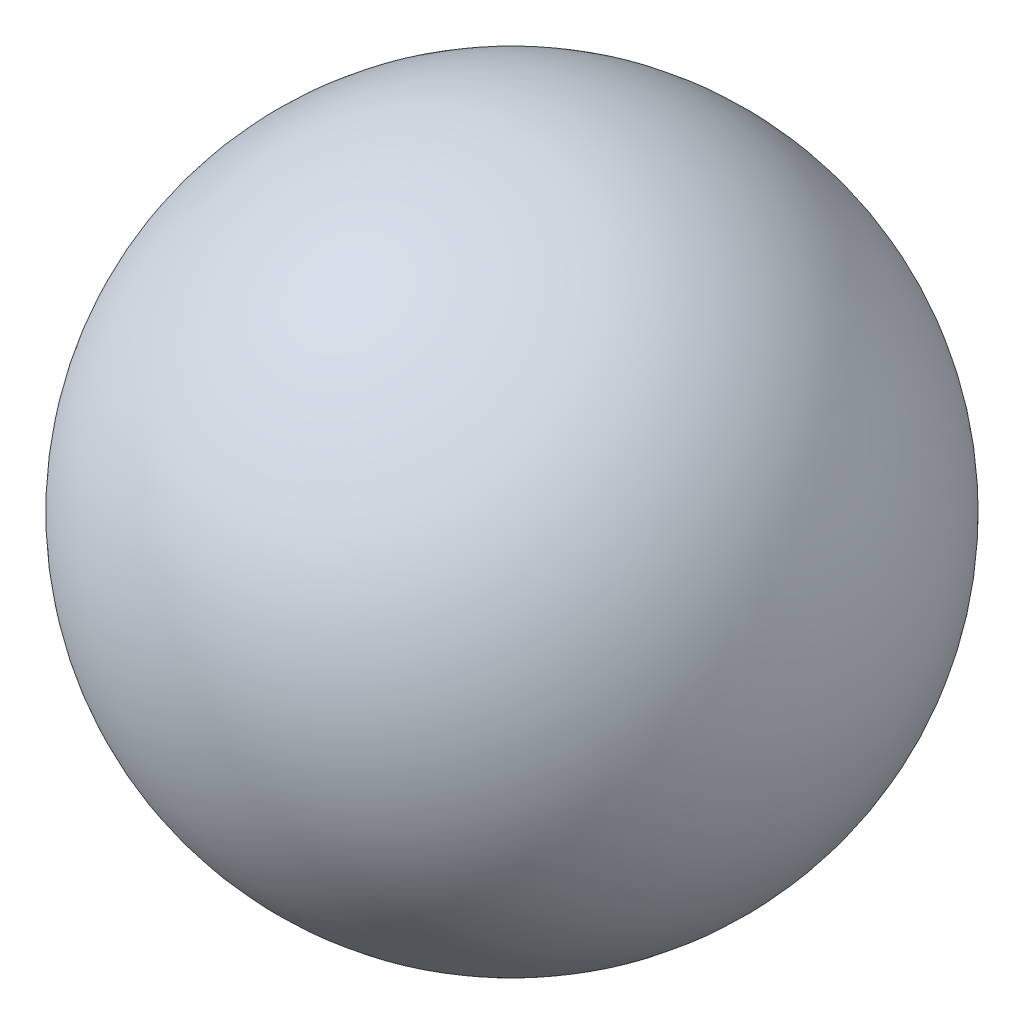
ISO-10303-21;
HEADER;
FILE_DESCRIPTION(('STEP AP214'),'2;1');
FILE_NAME('part.step','',(''),(''),'','','');
FILE_SCHEMA(('AUTOMOTIVE_DESIGN { 1 0 10303 214 1 1 1 1 }'));
ENDSEC;
DATA;
#1=APPLICATION_CONTEXT('core data for automotive mechanical design processes');
#2=APPLICATION_PROTOCOL_DEFINITION('international standard','automotive_design',2000,#1);
#3=PRODUCT_CONTEXT('',#1,'mechanical');
#4=PRODUCT('Part','Part','',(#3));
#5=PRODUCT_RELATED_PRODUCT_CATEGORY('part','',(#4));
#6=PRODUCT_DEFINITION_FORMATION('','',#4);
#7=PRODUCT_DEFINITION_CONTEXT('part definition',#1,'design');
#8=PRODUCT_DEFINITION('design','',#6,#7);
#9=PRODUCT_DEFINITION_SHAPE('','',#8);
#10=(LENGTH_UNIT() NAMED_UNIT(*) SI_UNIT(.MILLI.,.METRE.));
#11=(NAMED_UNIT(*) PLANE_ANGLE_UNIT() SI_UNIT($,.RADIAN.));
#12=(NAMED_UNIT(*) SI_UNIT($,.STERADIAN.) SOLID_ANGLE_UNIT());
#13=UNCERTAINTY_MEASURE_WITH_UNIT(LENGTH_MEASURE(1.E-05),#10,'distance_accuracy_value','');
#14=(GEOMETRIC_REPRESENTATION_CONTEXT(3) GLOBAL_UNCERTAINTY_ASSIGNED_CONTEXT((#13)) GLOBAL_UNIT_ASSIGNED_CONTEXT((#10,
#11,#12)) REPRESENTATION_CONTEXT('',''));
#15=CARTESIAN_POINT('',(0.,0.,0.));
#16=DIRECTION('',(0.,0.,1.));
#17=DIRECTION('',(1.,0.,0.));
#18=AXIS2_PLACEMENT_3D('',#15,#16,#17);
#19=CARTESIAN_POINT('',(0.,0.,0.));
#20=DIRECTION('',(0.,-1.,0.));
#21=DIRECTION('',(1.,0.,0.));
#22=AXIS2_PLACEMENT_3D('',#19,#20,#21);
#23=SPHERICAL_SURFACE('',#22,120.5);
#24=CARTESIAN_POINT('',(4.13345004365735E-13,-120.5,0.));
#25=VERTEX_POINT('',#24);
#26=VERTEX_LOOP('',#25);
#27=FACE_BOUND('',#26,.T.);
#28=ADVANCED_FACE('F39',(#27),#23,.T.);
#29=CLOSED_SHELL('',(#28));
#30=MANIFOLD_SOLID_BREP('B2',#29);
#31=ADVANCED_BREP_SHAPE_REPRESENTATION('',(#18,#30),#14);
#32=SHAPE_DEFINITION_REPRESENTATION(#9,#31);
ENDSEC;
END-ISO-10303-21;
